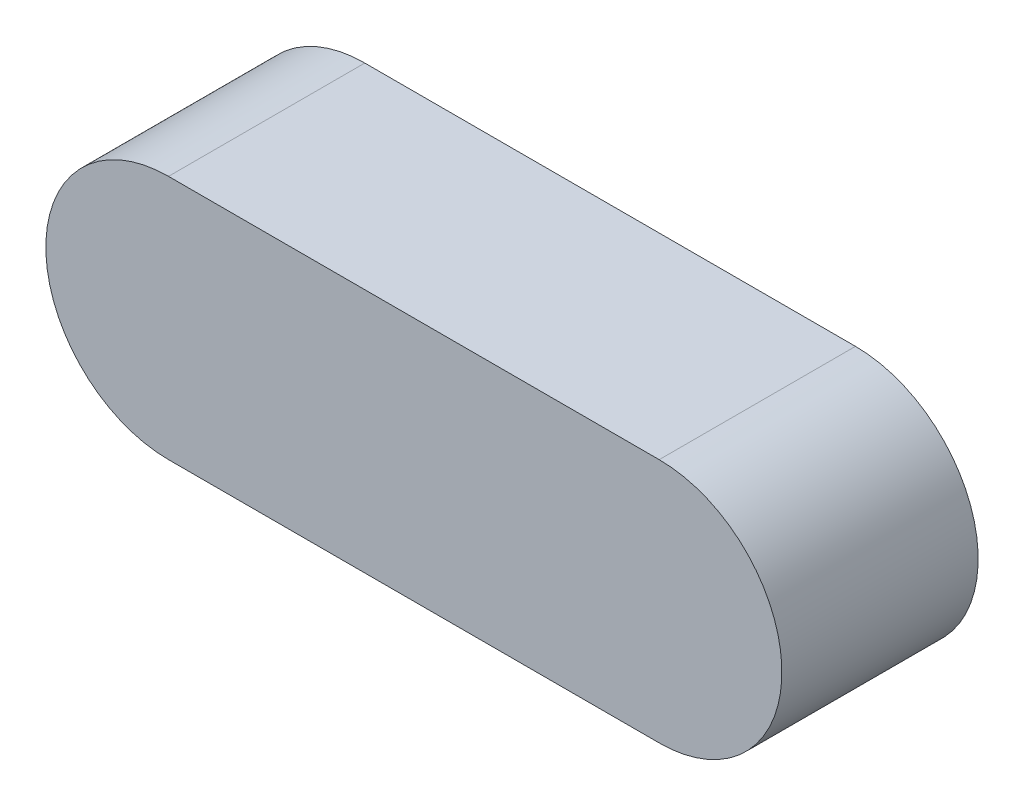
ISO-10303-21;
HEADER;
FILE_DESCRIPTION(('STEP AP214'),'2;1');
FILE_NAME('part.step','',(''),(''),'','','');
FILE_SCHEMA(('AUTOMOTIVE_DESIGN { 1 0 10303 214 1 1 1 1 }'));
ENDSEC;
DATA;
#1=APPLICATION_CONTEXT('core data for automotive mechanical design processes');
#2=APPLICATION_PROTOCOL_DEFINITION('international standard','automotive_design',2000,#1);
#3=PRODUCT_CONTEXT('',#1,'mechanical');
#4=PRODUCT('Part','Part','',(#3));
#5=PRODUCT_RELATED_PRODUCT_CATEGORY('part','',(#4));
#6=PRODUCT_DEFINITION_FORMATION('','',#4);
#7=PRODUCT_DEFINITION_CONTEXT('part definition',#1,'design');
#8=PRODUCT_DEFINITION('design','',#6,#7);
#9=PRODUCT_DEFINITION_SHAPE('','',#8);
#10=(LENGTH_UNIT() NAMED_UNIT(*) SI_UNIT(.MILLI.,.METRE.));
#11=(NAMED_UNIT(*) PLANE_ANGLE_UNIT() SI_UNIT($,.RADIAN.));
#12=(NAMED_UNIT(*) SI_UNIT($,.STERADIAN.) SOLID_ANGLE_UNIT());
#13=UNCERTAINTY_MEASURE_WITH_UNIT(LENGTH_MEASURE(1.E-05),#10,'distance_accuracy_value','');
#14=(GEOMETRIC_REPRESENTATION_CONTEXT(3) GLOBAL_UNCERTAINTY_ASSIGNED_CONTEXT((#13)) GLOBAL_UNIT_ASSIGNED_CONTEXT((#10,
#11,#12)) REPRESENTATION_CONTEXT('',''));
#15=CARTESIAN_POINT('',(0.,0.,0.));
#16=DIRECTION('',(0.,0.,1.));
#17=DIRECTION('',(1.,0.,0.));
#18=AXIS2_PLACEMENT_3D('',#15,#16,#17);
#19=CARTESIAN_POINT('',(0.,0.,7.99999999999999));
#20=DIRECTION('',(0.,0.,-1.));
#21=DIRECTION('',(-1.,0.,0.));
#22=AXIS2_PLACEMENT_3D('',#19,#20,#21);
#23=CYLINDRICAL_SURFACE('',#22,5.);
#24=CARTESIAN_POINT('',(0.,0.,0.));
#25=DIRECTION('',(0.,0.,1.));
#26=DIRECTION('',(1.,0.,0.));
#27=AXIS2_PLACEMENT_3D('',#24,#25,#26);
#28=CIRCLE('',#27,5.);
#29=CARTESIAN_POINT('',(0.,4.99999999999996,0.));
#30=VERTEX_POINT('',#29);
#31=CARTESIAN_POINT('',(0.,-5.,0.));
#32=VERTEX_POINT('',#31);
#33=EDGE_CURVE('E109',#30,#32,#28,.T.);
#34=ORIENTED_EDGE('',*,*,#33,.T.);
#35=DIRECTION('',(0.,0.,-1.));
#36=VECTOR('',#35,1.);
#37=CARTESIAN_POINT('',(0.,-5.,7.99999999999999));
#38=LINE('',#37,#36);
#39=CARTESIAN_POINT('',(0.,-5.,7.99999999999999));
#40=VERTEX_POINT('',#39);
#41=EDGE_CURVE('E11',#40,#32,#38,.T.);
#42=ORIENTED_EDGE('',*,*,#41,.F.);
#43=CARTESIAN_POINT('',(0.,0.,7.99999999999999));
#44=DIRECTION('',(0.,0.,1.));
#45=DIRECTION('',(1.,0.,0.));
#46=AXIS2_PLACEMENT_3D('',#43,#44,#45);
#47=CIRCLE('',#46,5.);
#48=CARTESIAN_POINT('',(0.,4.99999999999996,7.99999999999999));
#49=VERTEX_POINT('',#48);
#50=EDGE_CURVE('E91',#49,#40,#47,.T.);
#51=ORIENTED_EDGE('',*,*,#50,.F.);
#52=DIRECTION('',(0.,0.,-1.));
#53=VECTOR('',#52,1.);
#54=CARTESIAN_POINT('',(0.,4.99999999999996,7.99999999999999));
#55=LINE('',#54,#53);
#56=EDGE_CURVE('E105',#49,#30,#55,.T.);
#57=ORIENTED_EDGE('',*,*,#56,.T.);
#58=EDGE_LOOP('',(#34,#42,#51,#57));
#59=FACE_BOUND('',#58,.T.);
#60=ADVANCED_FACE('F39',(#59),#23,.T.);
#61=CARTESIAN_POINT('',(0.,-5.,7.99999999999999));
#62=DIRECTION('',(0.,1.,0.));
#63=DIRECTION('',(0.,0.,1.));
#64=AXIS2_PLACEMENT_3D('',#61,#62,#63);
#65=PLANE('',#64);
#66=DIRECTION('',(1.,0.,0.));
#67=VECTOR('',#66,1.);
#68=CARTESIAN_POINT('',(0.,-5.,0.));
#69=LINE('',#68,#67);
#70=CARTESIAN_POINT('',(20.,-4.99999999999999,0.));
#71=VERTEX_POINT('',#70);
#72=EDGE_CURVE('E96',#32,#71,#69,.T.);
#73=ORIENTED_EDGE('',*,*,#72,.T.);
#74=DIRECTION('',(0.,0.,-1.));
#75=VECTOR('',#74,1.);
#76=CARTESIAN_POINT('',(20.,-4.99999999999999,7.99999999999999));
#77=LINE('',#76,#75);
#78=CARTESIAN_POINT('',(20.,-4.99999999999999,7.99999999999999));
#79=VERTEX_POINT('',#78);
#80=EDGE_CURVE('E48',#79,#71,#77,.T.);
#81=ORIENTED_EDGE('',*,*,#80,.F.);
#82=DIRECTION('',(1.,0.,0.));
#83=VECTOR('',#82,1.);
#84=CARTESIAN_POINT('',(0.,-5.,7.99999999999999));
#85=LINE('',#84,#83);
#86=EDGE_CURVE('E86',#40,#79,#85,.T.);
#87=ORIENTED_EDGE('',*,*,#86,.F.);
#88=ORIENTED_EDGE('',*,*,#41,.T.);
#89=EDGE_LOOP('',(#73,#81,#87,#88));
#90=FACE_BOUND('',#89,.T.);
#91=ADVANCED_FACE('F95',(#90),#65,.F.);
#92=CARTESIAN_POINT('',(20.,0.,7.99999999999999));
#93=DIRECTION('',(0.,0.,-1.));
#94=DIRECTION('',(-1.,0.,0.));
#95=AXIS2_PLACEMENT_3D('',#92,#93,#94);
#96=CYLINDRICAL_SURFACE('',#95,5.);
#97=CARTESIAN_POINT('',(20.,0.,0.));
#98=DIRECTION('',(0.,0.,1.));
#99=DIRECTION('',(1.,0.,0.));
#100=AXIS2_PLACEMENT_3D('',#97,#98,#99);
#101=CIRCLE('',#100,5.);
#102=CARTESIAN_POINT('',(20.,4.99999999999999,0.));
#103=VERTEX_POINT('',#102);
#104=EDGE_CURVE('E73',#71,#103,#101,.T.);
#105=ORIENTED_EDGE('',*,*,#104,.T.);
#106=DIRECTION('',(0.,0.,-1.));
#107=VECTOR('',#106,1.);
#108=CARTESIAN_POINT('',(20.,4.99999999999999,7.99999999999997));
#109=LINE('',#108,#107);
#110=CARTESIAN_POINT('',(20.,4.99999999999999,7.99999999999997));
#111=VERTEX_POINT('',#110);
#112=EDGE_CURVE('E98',#111,#103,#109,.T.);
#113=ORIENTED_EDGE('',*,*,#112,.F.);
#114=CARTESIAN_POINT('',(20.,0.,7.99999999999999));
#115=DIRECTION('',(0.,0.,1.));
#116=DIRECTION('',(1.,0.,0.));
#117=AXIS2_PLACEMENT_3D('',#114,#115,#116);
#118=CIRCLE('',#117,5.);
#119=EDGE_CURVE('E89',#79,#111,#118,.T.);
#120=ORIENTED_EDGE('',*,*,#119,.F.);
#121=ORIENTED_EDGE('',*,*,#80,.T.);
#122=EDGE_LOOP('',(#105,#113,#120,#121));
#123=FACE_BOUND('',#122,.T.);
#124=ADVANCED_FACE('F99',(#123),#96,.T.);
#125=CARTESIAN_POINT('',(0.,4.99999999999996,7.99999999999999));
#126=DIRECTION('',(0.,-1.,0.));
#127=DIRECTION('',(0.,0.,-1.));
#128=AXIS2_PLACEMENT_3D('',#125,#126,#127);
#129=PLANE('',#128);
#130=DIRECTION('',(-1.,0.,0.));
#131=VECTOR('',#130,1.);
#132=CARTESIAN_POINT('',(0.,4.99999999999996,0.));
#133=LINE('',#132,#131);
#134=EDGE_CURVE('E79',#103,#30,#133,.T.);
#135=ORIENTED_EDGE('',*,*,#134,.T.);
#136=ORIENTED_EDGE('',*,*,#56,.F.);
#137=DIRECTION('',(-1.,0.,0.));
#138=VECTOR('',#137,1.);
#139=CARTESIAN_POINT('',(0.,4.99999999999996,7.99999999999999));
#140=LINE('',#139,#138);
#141=EDGE_CURVE('E56',#111,#49,#140,.T.);
#142=ORIENTED_EDGE('',*,*,#141,.F.);
#143=ORIENTED_EDGE('',*,*,#112,.T.);
#144=EDGE_LOOP('',(#135,#136,#142,#143));
#145=FACE_BOUND('',#144,.T.);
#146=ADVANCED_FACE('F124',(#145),#129,.F.);
#147=CARTESIAN_POINT('',(0.,0.,7.99999999999999));
#148=DIRECTION('',(0.,0.,1.));
#149=DIRECTION('',(1.,0.,0.));
#150=AXIS2_PLACEMENT_3D('',#147,#148,#149);
#151=PLANE('',#150);
#152=ORIENTED_EDGE('',*,*,#50,.T.);
#153=ORIENTED_EDGE('',*,*,#86,.T.);
#154=ORIENTED_EDGE('',*,*,#119,.T.);
#155=ORIENTED_EDGE('',*,*,#141,.T.);
#156=EDGE_LOOP('',(#152,#153,#154,#155));
#157=FACE_BOUND('',#156,.T.);
#158=ADVANCED_FACE('F87',(#157),#151,.T.);
#159=CARTESIAN_POINT('',(0.,0.,0.));
#160=DIRECTION('',(0.,0.,1.));
#161=DIRECTION('',(1.,0.,0.));
#162=AXIS2_PLACEMENT_3D('',#159,#160,#161);
#163=PLANE('',#162);
#164=ORIENTED_EDGE('',*,*,#33,.F.);
#165=ORIENTED_EDGE('',*,*,#134,.F.);
#166=ORIENTED_EDGE('',*,*,#104,.F.);
#167=ORIENTED_EDGE('',*,*,#72,.F.);
#168=EDGE_LOOP('',(#164,#165,#166,#167));
#169=FACE_BOUND('',#168,.T.);
#170=ADVANCED_FACE('F127',(#169),#163,.F.);
#171=CLOSED_SHELL('',(#60,#91,#124,#146,#158,#170));
#172=MANIFOLD_SOLID_BREP('B2',#171);
#173=ADVANCED_BREP_SHAPE_REPRESENTATION('',(#18,#172),#14);
#174=SHAPE_DEFINITION_REPRESENTATION(#9,#173);
ENDSEC;
END-ISO-10303-21;
